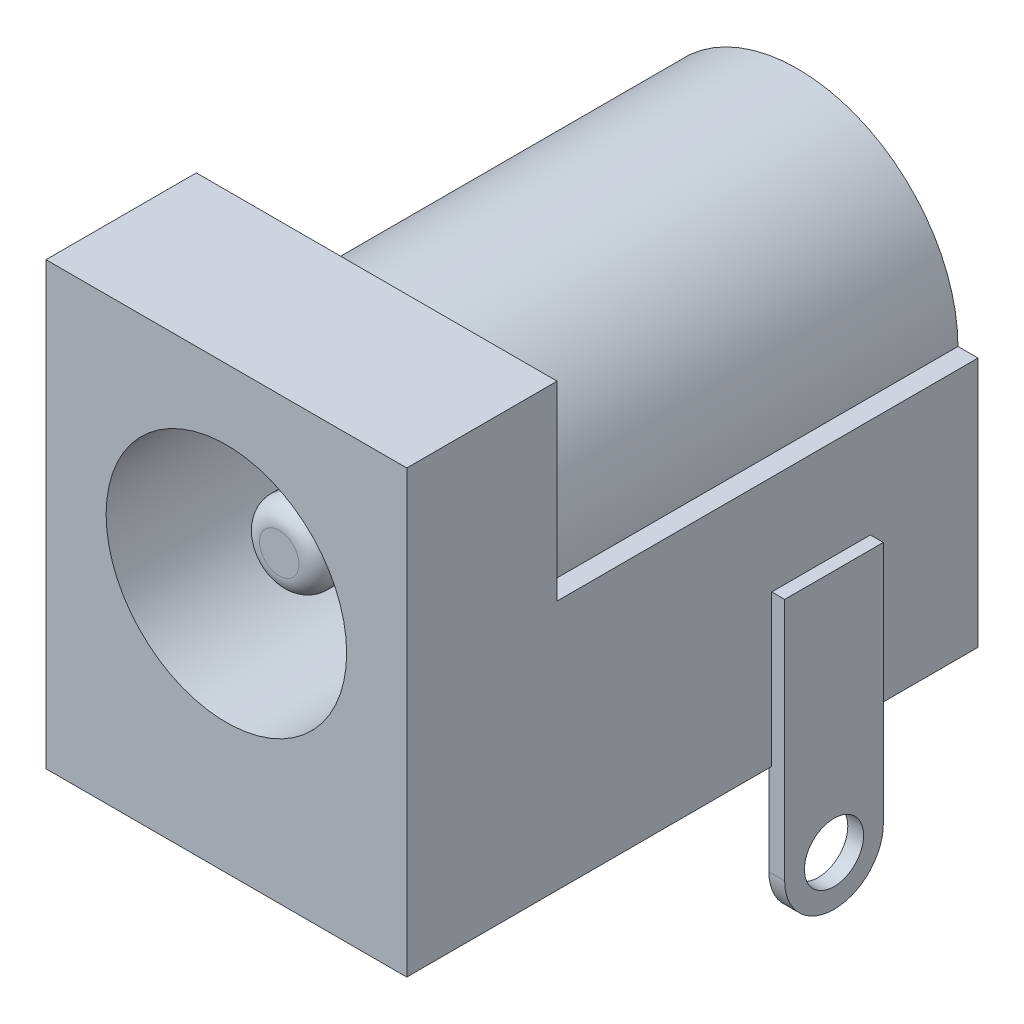
ISO-10303-21;
HEADER;
FILE_DESCRIPTION(('STEP AP214'),'2;1');
FILE_NAME('part.step','',(''),(''),'','','');
FILE_SCHEMA(('AUTOMOTIVE_DESIGN { 1 0 10303 214 1 1 1 1 }'));
ENDSEC;
DATA;
#1=APPLICATION_CONTEXT('core data for automotive mechanical design processes');
#2=APPLICATION_PROTOCOL_DEFINITION('international standard','automotive_design',2000,#1);
#3=PRODUCT_CONTEXT('',#1,'mechanical');
#4=PRODUCT('Part','Part','',(#3));
#5=PRODUCT_RELATED_PRODUCT_CATEGORY('part','',(#4));
#6=PRODUCT_DEFINITION_FORMATION('','',#4);
#7=PRODUCT_DEFINITION_CONTEXT('part definition',#1,'design');
#8=PRODUCT_DEFINITION('design','',#6,#7);
#9=PRODUCT_DEFINITION_SHAPE('','',#8);
#10=(LENGTH_UNIT() NAMED_UNIT(*) SI_UNIT(.MILLI.,.METRE.));
#11=(NAMED_UNIT(*) PLANE_ANGLE_UNIT() SI_UNIT($,.RADIAN.));
#12=(NAMED_UNIT(*) SI_UNIT($,.STERADIAN.) SOLID_ANGLE_UNIT());
#13=UNCERTAINTY_MEASURE_WITH_UNIT(LENGTH_MEASURE(1.E-05),#10,'distance_accuracy_value','');
#14=(GEOMETRIC_REPRESENTATION_CONTEXT(3) GLOBAL_UNCERTAINTY_ASSIGNED_CONTEXT((#13)) GLOBAL_UNIT_ASSIGNED_CONTEXT((#10,
#11,#12)) REPRESENTATION_CONTEXT('',''));
#15=CARTESIAN_POINT('',(0.,0.,0.));
#16=DIRECTION('',(0.,0.,1.));
#17=DIRECTION('',(1.,0.,0.));
#18=AXIS2_PLACEMENT_3D('',#15,#16,#17);
#19=CARTESIAN_POINT('',(-4.572,0.,-3.81));
#20=DIRECTION('',(0.,-1.,0.));
#21=DIRECTION('',(1.,0.,0.));
#22=AXIS2_PLACEMENT_3D('',#19,#20,#21);
#23=PLANE('',#22);
#24=DIRECTION('',(-1.,0.,0.));
#25=VECTOR('',#24,1.);
#26=CARTESIAN_POINT('',(-1.1,0.,-7.65));
#27=LINE('',#26,#25);
#28=CARTESIAN_POINT('',(1.1,0.,-7.65));
#29=VERTEX_POINT('',#28);
#30=CARTESIAN_POINT('',(-1.1,0.,-7.65));
#31=VERTEX_POINT('',#30);
#32=EDGE_CURVE('E56',#29,#31,#27,.T.);
#33=ORIENTED_EDGE('',*,*,#32,.T.);
#34=DIRECTION('',(0.,0.,-1.));
#35=VECTOR('',#34,1.);
#36=CARTESIAN_POINT('',(-1.1,0.,-7.35));
#37=LINE('',#36,#35);
#38=CARTESIAN_POINT('',(-1.1,0.,-7.35));
#39=VERTEX_POINT('',#38);
#40=EDGE_CURVE('E256',#39,#31,#37,.T.);
#41=ORIENTED_EDGE('',*,*,#40,.F.);
#42=DIRECTION('',(-1.,0.,0.));
#43=VECTOR('',#42,1.);
#44=CARTESIAN_POINT('',(-1.1,0.,-7.35));
#45=LINE('',#44,#43);
#46=CARTESIAN_POINT('',(1.1,0.,-7.35));
#47=VERTEX_POINT('',#46);
#48=EDGE_CURVE('E238',#47,#39,#45,.T.);
#49=ORIENTED_EDGE('',*,*,#48,.F.);
#50=DIRECTION('',(0.,0.,-1.));
#51=VECTOR('',#50,1.);
#52=CARTESIAN_POINT('',(1.1,0.,-7.35));
#53=LINE('',#52,#51);
#54=EDGE_CURVE('E247',#47,#29,#53,.T.);
#55=ORIENTED_EDGE('',*,*,#54,.T.);
#56=EDGE_LOOP('',(#33,#41,#49,#55));
#57=FACE_BOUND('',#56,.T.);
#58=DIRECTION('',(0.,0.,-1.));
#59=VECTOR('',#58,1.);
#60=CARTESIAN_POINT('',(4.5,0.,-3.81));
#61=LINE('',#60,#59);
#62=CARTESIAN_POINT('',(4.5,0.,-9.2499999999999));
#63=VERTEX_POINT('',#62);
#64=CARTESIAN_POINT('',(4.5,0.,-11.7499999999999));
#65=VERTEX_POINT('',#64);
#66=EDGE_CURVE('E349',#63,#65,#61,.T.);
#67=ORIENTED_EDGE('',*,*,#66,.F.);
#68=DIRECTION('',(1.,0.,0.));
#69=VECTOR('',#68,1.);
#70=CARTESIAN_POINT('',(-4.572,0.,-9.2499999999999));
#71=LINE('',#70,#69);
#72=CARTESIAN_POINT('',(4.572,0.,-9.2499999999999));
#73=VERTEX_POINT('',#72);
#74=EDGE_CURVE('E41',#63,#73,#71,.T.);
#75=ORIENTED_EDGE('',*,*,#74,.T.);
#76=DIRECTION('',(0.,0.,1.));
#77=VECTOR('',#76,1.);
#78=CARTESIAN_POINT('',(4.572,-1.52655665885959E-13,-3.8099999999999));
#79=LINE('',#78,#77);
#80=CARTESIAN_POINT('',(4.572,-1.04083408558608E-13,1.04083408558608E-13));
#81=VERTEX_POINT('',#80);
#82=EDGE_CURVE('E356',#73,#81,#79,.T.);
#83=ORIENTED_EDGE('',*,*,#82,.T.);
#84=DIRECTION('',(1.,0.,0.));
#85=VECTOR('',#84,1.);
#86=CARTESIAN_POINT('',(-4.572,0.,0.));
#87=LINE('',#86,#85);
#88=CARTESIAN_POINT('',(-4.572,0.,0.));
#89=VERTEX_POINT('',#88);
#90=EDGE_CURVE('E393',#89,#81,#87,.T.);
#91=ORIENTED_EDGE('',*,*,#90,.F.);
#92=DIRECTION('',(0.,0.,1.));
#93=VECTOR('',#92,1.);
#94=CARTESIAN_POINT('',(-4.572,0.,-3.81));
#95=LINE('',#94,#93);
#96=CARTESIAN_POINT('',(-4.57200000000008,0.,-14.478));
#97=VERTEX_POINT('',#96);
#98=EDGE_CURVE('E366',#97,#89,#95,.T.);
#99=ORIENTED_EDGE('',*,*,#98,.F.);
#100=DIRECTION('',(-1.,0.,0.));
#101=VECTOR('',#100,1.);
#102=CARTESIAN_POINT('',(-4.57200000000008,0.,-14.478));
#103=LINE('',#102,#101);
#104=CARTESIAN_POINT('',(4.57199999999992,-1.52655665885959E-13,-14.4779999999999));
#105=VERTEX_POINT('',#104);
#106=EDGE_CURVE('E769',#105,#97,#103,.T.);
#107=ORIENTED_EDGE('',*,*,#106,.F.);
#108=CARTESIAN_POINT('',(4.572,0.,-11.7499999999999));
#109=VERTEX_POINT('',#108);
#110=EDGE_CURVE('E365',#105,#109,#79,.T.);
#111=ORIENTED_EDGE('',*,*,#110,.T.);
#112=DIRECTION('',(-1.,0.,0.));
#113=VECTOR('',#112,1.);
#114=CARTESIAN_POINT('',(-4.572,0.,-11.7499999999999));
#115=LINE('',#114,#113);
#116=EDGE_CURVE('E346',#109,#65,#115,.T.);
#117=ORIENTED_EDGE('',*,*,#116,.T.);
#118=EDGE_LOOP('',(#67,#75,#83,#91,#99,#107,#111,#117));
#119=FACE_BOUND('',#118,.T.);
#120=DIRECTION('',(-1.,0.,0.));
#121=VECTOR('',#120,1.);
#122=CARTESIAN_POINT('',(1.425,-1.52655665885959E-13,-13.9));
#123=LINE('',#122,#121);
#124=CARTESIAN_POINT('',(1.425,0.,-13.9));
#125=VERTEX_POINT('',#124);
#126=CARTESIAN_POINT('',(-1.425,-1.53004678696798E-13,-13.9));
#127=VERTEX_POINT('',#126);
#128=EDGE_CURVE('E48',#125,#127,#123,.T.);
#129=ORIENTED_EDGE('',*,*,#128,.T.);
#130=DIRECTION('',(0.,0.,-1.));
#131=VECTOR('',#130,1.);
#132=CARTESIAN_POINT('',(-1.425,-1.53004678696798E-13,-13.5));
#133=LINE('',#132,#131);
#134=CARTESIAN_POINT('',(-1.425,-1.53004678696798E-13,-13.5));
#135=VERTEX_POINT('',#134);
#136=EDGE_CURVE('E192',#135,#127,#133,.T.);
#137=ORIENTED_EDGE('',*,*,#136,.F.);
#138=DIRECTION('',(-1.,0.,0.));
#139=VECTOR('',#138,1.);
#140=CARTESIAN_POINT('',(1.425,-1.52655665885959E-13,-13.5));
#141=LINE('',#140,#139);
#142=CARTESIAN_POINT('',(1.425,-1.52655665885959E-13,-13.5));
#143=VERTEX_POINT('',#142);
#144=EDGE_CURVE('E214',#143,#135,#141,.T.);
#145=ORIENTED_EDGE('',*,*,#144,.F.);
#146=DIRECTION('',(0.,0.,-1.));
#147=VECTOR('',#146,1.);
#148=CARTESIAN_POINT('',(1.425,-1.52655665885959E-13,-13.5));
#149=LINE('',#148,#147);
#150=EDGE_CURVE('E203',#143,#125,#149,.T.);
#151=ORIENTED_EDGE('',*,*,#150,.T.);
#152=EDGE_LOOP('',(#129,#137,#145,#151));
#153=FACE_BOUND('',#152,.T.);
#154=ADVANCED_FACE('F33',(#57,#119,#153),#23,.T.);
#155=CARTESIAN_POINT('',(4.572,-1.52655665885959E-13,-3.8099999999999));
#156=DIRECTION('',(1.,0.,0.));
#157=DIRECTION('',(0.,0.,-1.));
#158=AXIS2_PLACEMENT_3D('',#155,#156,#157);
#159=PLANE('',#158);
#160=ORIENTED_EDGE('',*,*,#82,.F.);
#161=DIRECTION('',(0.,1.,0.));
#162=VECTOR('',#161,1.);
#163=CARTESIAN_POINT('',(4.57200000000002,-1.51128660107753E-13,-9.2499999999999));
#164=LINE('',#163,#162);
#165=CARTESIAN_POINT('',(4.57200000000002,3.8299999999999,-9.2499999999999));
#166=VERTEX_POINT('',#165);
#167=EDGE_CURVE('E295',#73,#166,#164,.T.);
#168=ORIENTED_EDGE('',*,*,#167,.T.);
#169=DIRECTION('',(0.,0.,-1.));
#170=VECTOR('',#169,1.);
#171=CARTESIAN_POINT('',(4.572,3.8299999999999,-3.8099999999999));
#172=LINE('',#171,#170);
#173=CARTESIAN_POINT('',(4.57200000000003,3.8299999999999,-11.7499999999999));
#174=VERTEX_POINT('',#173);
#175=EDGE_CURVE('E12',#166,#174,#172,.T.);
#176=ORIENTED_EDGE('',*,*,#175,.T.);
#177=DIRECTION('',(0.,-1.,0.));
#178=VECTOR('',#177,1.);
#179=CARTESIAN_POINT('',(4.57200000000003,-1.52655665885959E-13,-11.7499999999999));
#180=LINE('',#179,#178);
#181=EDGE_CURVE('E292',#174,#109,#180,.T.);
#182=ORIENTED_EDGE('',*,*,#181,.T.);
#183=ORIENTED_EDGE('',*,*,#110,.F.);
#184=DIRECTION('',(0.,-1.,0.));
#185=VECTOR('',#184,1.);
#186=CARTESIAN_POINT('',(4.57199999999992,-1.52655665885959E-13,-14.4779999999999));
#187=LINE('',#186,#185);
#188=CARTESIAN_POINT('',(4.572,6.34999999999983,-14.478));
#189=VERTEX_POINT('',#188);
#190=EDGE_CURVE('E766',#189,#105,#187,.T.);
#191=ORIENTED_EDGE('',*,*,#190,.F.);
#192=DIRECTION('',(0.,0.,1.));
#193=VECTOR('',#192,1.);
#194=CARTESIAN_POINT('',(4.572,6.34999999999983,-14.478));
#195=LINE('',#194,#193);
#196=CARTESIAN_POINT('',(4.57200000000001,6.34999999999983,-3.81));
#197=VERTEX_POINT('',#196);
#198=EDGE_CURVE('E323',#189,#197,#195,.T.);
#199=ORIENTED_EDGE('',*,*,#198,.T.);
#200=DIRECTION('',(0.,1.,0.));
#201=VECTOR('',#200,1.);
#202=CARTESIAN_POINT('',(4.572,-1.52655665885959E-13,-3.8099999999999));
#203=LINE('',#202,#201);
#204=CARTESIAN_POINT('',(4.572,11.1759999999998,-3.81));
#205=VERTEX_POINT('',#204);
#206=EDGE_CURVE('E320',#197,#205,#203,.T.);
#207=ORIENTED_EDGE('',*,*,#206,.T.);
#208=DIRECTION('',(0.,0.,1.));
#209=VECTOR('',#208,1.);
#210=CARTESIAN_POINT('',(4.572,11.1759999999998,-3.81));
#211=LINE('',#210,#209);
#212=CARTESIAN_POINT('',(4.572,11.1759999999999,0.));
#213=VERTEX_POINT('',#212);
#214=EDGE_CURVE('E369',#205,#213,#211,.T.);
#215=ORIENTED_EDGE('',*,*,#214,.T.);
#216=DIRECTION('',(0.,1.,0.));
#217=VECTOR('',#216,1.);
#218=CARTESIAN_POINT('',(4.572,-1.04083408558608E-13,1.04083408558608E-13));
#219=LINE('',#218,#217);
#220=EDGE_CURVE('E363',#81,#213,#219,.T.);
#221=ORIENTED_EDGE('',*,*,#220,.F.);
#222=EDGE_LOOP('',(#160,#168,#176,#182,#183,#191,#199,#207,#215,#221));
#223=FACE_BOUND('',#222,.T.);
#224=ADVANCED_FACE('F361',(#223),#159,.T.);
#225=CARTESIAN_POINT('',(0.,6.3499999999999,-9.1440000000001));
#226=DIRECTION('',(0.,0.,1.));
#227=DIRECTION('',(1.,0.,0.));
#228=AXIS2_PLACEMENT_3D('',#225,#226,#227);
#229=PLANE('',#228);
#230=CARTESIAN_POINT('',(0.,6.3499999999999,-9.1440000000001));
#231=DIRECTION('',(0.,0.,1.));
#232=DIRECTION('',(1.,0.,0.));
#233=AXIS2_PLACEMENT_3D('',#230,#231,#232);
#234=CIRCLE('',#233,3.048);
#235=CARTESIAN_POINT('',(3.048,6.3499999999999,-9.14400000000009));
#236=VERTEX_POINT('',#235);
#237=EDGE_CURVE('E304',#236,#236,#234,.T.);
#238=ORIENTED_EDGE('',*,*,#237,.T.);
#239=EDGE_LOOP('',(#238));
#240=FACE_BOUND('',#239,.T.);
#241=CARTESIAN_POINT('',(0.,6.3499999999999,-9.14400000000011));
#242=DIRECTION('',(0.,0.,1.));
#243=DIRECTION('',(1.,0.,0.));
#244=AXIS2_PLACEMENT_3D('',#241,#242,#243);
#245=CIRCLE('',#244,1.);
#246=CARTESIAN_POINT('',(-1.,6.3499999999999,-9.14400000000011));
#247=VERTEX_POINT('',#246);
#248=EDGE_CURVE('E298',#247,#247,#245,.T.);
#249=ORIENTED_EDGE('',*,*,#248,.F.);
#250=EDGE_LOOP('',(#249));
#251=FACE_BOUND('',#250,.T.);
#252=ADVANCED_FACE('F404',(#240,#251),#229,.T.);
#253=CARTESIAN_POINT('',(-4.572,0.,-3.81));
#254=DIRECTION('',(-1.,0.,0.));
#255=DIRECTION('',(0.,-1.,0.));
#256=AXIS2_PLACEMENT_3D('',#253,#254,#255);
#257=PLANE('',#256);
#258=DIRECTION('',(0.,-1.,0.));
#259=VECTOR('',#258,1.);
#260=CARTESIAN_POINT('',(-4.572,0.,0.));
#261=LINE('',#260,#259);
#262=CARTESIAN_POINT('',(-4.572,11.176,-1.04083408558608E-13));
#263=VERTEX_POINT('',#262);
#264=EDGE_CURVE('E778',#263,#89,#261,.T.);
#265=ORIENTED_EDGE('',*,*,#264,.F.);
#266=DIRECTION('',(0.,0.,1.));
#267=VECTOR('',#266,1.);
#268=CARTESIAN_POINT('',(-4.57200000000001,11.176,-3.8100000000001));
#269=LINE('',#268,#267);
#270=CARTESIAN_POINT('',(-4.57200000000001,11.176,-3.8100000000001));
#271=VERTEX_POINT('',#270);
#272=EDGE_CURVE('E343',#271,#263,#269,.T.);
#273=ORIENTED_EDGE('',*,*,#272,.F.);
#274=DIRECTION('',(0.,-1.,0.));
#275=VECTOR('',#274,1.);
#276=CARTESIAN_POINT('',(-4.572,0.,-3.81));
#277=LINE('',#276,#275);
#278=CARTESIAN_POINT('',(-4.572,6.34999999999998,-3.8100000000001));
#279=VERTEX_POINT('',#278);
#280=EDGE_CURVE('E374',#271,#279,#277,.T.);
#281=ORIENTED_EDGE('',*,*,#280,.T.);
#282=DIRECTION('',(0.,0.,1.));
#283=VECTOR('',#282,1.);
#284=CARTESIAN_POINT('',(-4.57200000000002,6.34999999999997,-14.4780000000001));
#285=LINE('',#284,#283);
#286=CARTESIAN_POINT('',(-4.57200000000002,6.34999999999997,-14.4780000000001));
#287=VERTEX_POINT('',#286);
#288=EDGE_CURVE('E327',#287,#279,#285,.T.);
#289=ORIENTED_EDGE('',*,*,#288,.F.);
#290=DIRECTION('',(0.,1.,0.));
#291=VECTOR('',#290,1.);
#292=CARTESIAN_POINT('',(-4.57200000000002,6.34999999999997,-14.4780000000001));
#293=LINE('',#292,#291);
#294=EDGE_CURVE('E762',#97,#287,#293,.T.);
#295=ORIENTED_EDGE('',*,*,#294,.F.);
#296=ORIENTED_EDGE('',*,*,#98,.T.);
#297=EDGE_LOOP('',(#265,#273,#281,#289,#295,#296));
#298=FACE_BOUND('',#297,.T.);
#299=ADVANCED_FACE('F35',(#298),#257,.T.);
#300=CARTESIAN_POINT('',(-4.57200000000001,11.176,-3.8100000000001));
#301=DIRECTION('',(0.,1.,0.));
#302=DIRECTION('',(-1.,0.,0.));
#303=AXIS2_PLACEMENT_3D('',#300,#301,#302);
#304=PLANE('',#303);
#305=DIRECTION('',(-1.,0.,0.));
#306=VECTOR('',#305,1.);
#307=CARTESIAN_POINT('',(-4.572,11.176,-1.04083408558608E-13));
#308=LINE('',#307,#306);
#309=EDGE_CURVE('E377',#213,#263,#308,.T.);
#310=ORIENTED_EDGE('',*,*,#309,.F.);
#311=ORIENTED_EDGE('',*,*,#214,.F.);
#312=DIRECTION('',(-1.,0.,0.));
#313=VECTOR('',#312,1.);
#314=CARTESIAN_POINT('',(-4.57200000000001,11.176,-3.8100000000001));
#315=LINE('',#314,#313);
#316=EDGE_CURVE('E370',#205,#271,#315,.T.);
#317=ORIENTED_EDGE('',*,*,#316,.T.);
#318=ORIENTED_EDGE('',*,*,#272,.T.);
#319=EDGE_LOOP('',(#310,#311,#317,#318));
#320=FACE_BOUND('',#319,.T.);
#321=ADVANCED_FACE('F394',(#320),#304,.T.);
#322=CARTESIAN_POINT('',(-4.57200000000001,11.176,-3.8100000000001));
#323=DIRECTION('',(0.,0.,-1.));
#324=DIRECTION('',(-1.,0.,0.));
#325=AXIS2_PLACEMENT_3D('',#322,#323,#324);
#326=PLANE('',#325);
#327=DIRECTION('',(1.,0.,0.));
#328=VECTOR('',#327,1.);
#329=CARTESIAN_POINT('',(-4.064,6.34999999999999,-3.8100000000001));
#330=LINE('',#329,#328);
#331=CARTESIAN_POINT('',(-4.064,6.34999999999999,-3.8100000000001));
#332=VERTEX_POINT('',#331);
#333=EDGE_CURVE('E319',#279,#332,#330,.T.);
#334=ORIENTED_EDGE('',*,*,#333,.F.);
#335=ORIENTED_EDGE('',*,*,#280,.F.);
#336=ORIENTED_EDGE('',*,*,#316,.F.);
#337=ORIENTED_EDGE('',*,*,#206,.F.);
#338=DIRECTION('',(1.,0.,0.));
#339=VECTOR('',#338,1.);
#340=CARTESIAN_POINT('',(4.06399999999999,6.3499999999999,-3.8100000000001));
#341=LINE('',#340,#339);
#342=CARTESIAN_POINT('',(4.06399999999999,6.3499999999999,-3.8100000000001));
#343=VERTEX_POINT('',#342);
#344=EDGE_CURVE('E310',#343,#197,#341,.T.);
#345=ORIENTED_EDGE('',*,*,#344,.F.);
#346=CARTESIAN_POINT('',(0.,6.3499999999999,-3.8100000000001));
#347=DIRECTION('',(0.,0.,-1.));
#348=DIRECTION('',(1.,0.,0.));
#349=AXIS2_PLACEMENT_3D('',#346,#347,#348);
#350=CIRCLE('',#349,4.064);
#351=EDGE_CURVE('E307',#332,#343,#350,.T.);
#352=ORIENTED_EDGE('',*,*,#351,.F.);
#353=EDGE_LOOP('',(#334,#335,#336,#337,#345,#352));
#354=FACE_BOUND('',#353,.T.);
#355=ADVANCED_FACE('F396',(#354),#326,.T.);
#356=CARTESIAN_POINT('',(-4.572,11.176,-1.04083408558608E-13));
#357=DIRECTION('',(0.,0.,-1.));
#358=DIRECTION('',(-1.,0.,0.));
#359=AXIS2_PLACEMENT_3D('',#356,#357,#358);
#360=PLANE('',#359);
#361=CARTESIAN_POINT('',(0.,6.3499999999999,-1.04083408558608E-13));
#362=DIRECTION('',(0.,0.,1.));
#363=DIRECTION('',(1.,0.,0.));
#364=AXIS2_PLACEMENT_3D('',#361,#362,#363);
#365=CIRCLE('',#364,3.048);
#366=CARTESIAN_POINT('',(3.048,6.3499999999999,0.));
#367=VERTEX_POINT('',#366);
#368=EDGE_CURVE('E301',#367,#367,#365,.T.);
#369=ORIENTED_EDGE('',*,*,#368,.F.);
#370=EDGE_LOOP('',(#369));
#371=FACE_BOUND('',#370,.T.);
#372=ORIENTED_EDGE('',*,*,#264,.T.);
#373=ORIENTED_EDGE('',*,*,#90,.T.);
#374=ORIENTED_EDGE('',*,*,#220,.T.);
#375=ORIENTED_EDGE('',*,*,#309,.T.);
#376=EDGE_LOOP('',(#372,#373,#374,#375));
#377=FACE_BOUND('',#376,.T.);
#378=ADVANCED_FACE('F392',(#371,#377),#360,.F.);
#379=CARTESIAN_POINT('',(0.,6.3499999999999,-14.4780000000001));
#380=DIRECTION('',(0.,0.,1.));
#381=DIRECTION('',(1.,0.,0.));
#382=AXIS2_PLACEMENT_3D('',#379,#380,#381);
#383=CYLINDRICAL_SURFACE('',#382,4.064);
#384=ORIENTED_EDGE('',*,*,#351,.T.);
#385=DIRECTION('',(0.,0.,1.));
#386=VECTOR('',#385,1.);
#387=CARTESIAN_POINT('',(4.06399999999999,6.34999999999984,-14.4780000000001));
#388=LINE('',#387,#386);
#389=CARTESIAN_POINT('',(4.06399999999999,6.34999999999984,-14.4780000000001));
#390=VERTEX_POINT('',#389);
#391=EDGE_CURVE('E326',#390,#343,#388,.T.);
#392=ORIENTED_EDGE('',*,*,#391,.F.);
#393=CARTESIAN_POINT('',(0.,6.3499999999999,-14.4780000000001));
#394=DIRECTION('',(0.,0.,-1.));
#395=DIRECTION('',(1.,0.,0.));
#396=AXIS2_PLACEMENT_3D('',#393,#394,#395);
#397=CIRCLE('',#396,4.064);
#398=CARTESIAN_POINT('',(-4.06400000000001,6.34999999999999,-14.4780000000001));
#399=VERTEX_POINT('',#398);
#400=EDGE_CURVE('E313',#399,#390,#397,.T.);
#401=ORIENTED_EDGE('',*,*,#400,.F.);
#402=DIRECTION('',(0.,0.,1.));
#403=VECTOR('',#402,1.);
#404=CARTESIAN_POINT('',(-4.06400000000001,6.34999999999999,-14.4780000000001));
#405=LINE('',#404,#403);
#406=EDGE_CURVE('E336',#399,#332,#405,.T.);
#407=ORIENTED_EDGE('',*,*,#406,.T.);
#408=EDGE_LOOP('',(#384,#392,#401,#407));
#409=FACE_BOUND('',#408,.T.);
#410=ADVANCED_FACE('F510',(#409),#383,.T.);
#411=CARTESIAN_POINT('',(4.06399999999999,6.34999999999984,-14.4780000000001));
#412=DIRECTION('',(0.,-1.,0.));
#413=DIRECTION('',(1.,0.,0.));
#414=AXIS2_PLACEMENT_3D('',#411,#412,#413);
#415=PLANE('',#414);
#416=ORIENTED_EDGE('',*,*,#344,.T.);
#417=ORIENTED_EDGE('',*,*,#198,.F.);
#418=DIRECTION('',(1.,0.,0.));
#419=VECTOR('',#418,1.);
#420=CARTESIAN_POINT('',(4.06399999999999,6.34999999999984,-14.4780000000001));
#421=LINE('',#420,#419);
#422=EDGE_CURVE('E770',#390,#189,#421,.T.);
#423=ORIENTED_EDGE('',*,*,#422,.F.);
#424=ORIENTED_EDGE('',*,*,#391,.T.);
#425=EDGE_LOOP('',(#416,#417,#423,#424));
#426=FACE_BOUND('',#425,.T.);
#427=ADVANCED_FACE('F506',(#426),#415,.F.);
#428=CARTESIAN_POINT('',(-4.06400000000001,6.34999999999999,-14.4780000000001));
#429=DIRECTION('',(0.,-1.,0.));
#430=DIRECTION('',(1.,0.,0.));
#431=AXIS2_PLACEMENT_3D('',#428,#429,#430);
#432=PLANE('',#431);
#433=ORIENTED_EDGE('',*,*,#333,.T.);
#434=ORIENTED_EDGE('',*,*,#406,.F.);
#435=DIRECTION('',(1.,0.,0.));
#436=VECTOR('',#435,1.);
#437=CARTESIAN_POINT('',(-4.06400000000001,6.34999999999999,-14.4780000000001));
#438=LINE('',#437,#436);
#439=EDGE_CURVE('E760',#287,#399,#438,.T.);
#440=ORIENTED_EDGE('',*,*,#439,.F.);
#441=ORIENTED_EDGE('',*,*,#288,.T.);
#442=EDGE_LOOP('',(#433,#434,#440,#441));
#443=FACE_BOUND('',#442,.T.);
#444=ADVANCED_FACE('F502',(#443),#432,.F.);
#445=CARTESIAN_POINT('',(0.,6.3499999999999,-14.4780000000001));
#446=DIRECTION('',(0.,0.,1.));
#447=DIRECTION('',(1.,0.,0.));
#448=AXIS2_PLACEMENT_3D('',#445,#446,#447);
#449=PLANE('',#448);
#450=ORIENTED_EDGE('',*,*,#400,.T.);
#451=ORIENTED_EDGE('',*,*,#422,.T.);
#452=ORIENTED_EDGE('',*,*,#190,.T.);
#453=ORIENTED_EDGE('',*,*,#106,.T.);
#454=ORIENTED_EDGE('',*,*,#294,.T.);
#455=ORIENTED_EDGE('',*,*,#439,.T.);
#456=EDGE_LOOP('',(#450,#451,#452,#453,#454,#455));
#457=FACE_BOUND('',#456,.T.);
#458=ADVANCED_FACE('F498',(#457),#449,.F.);
#459=CARTESIAN_POINT('',(0.,6.3499999999999,-9.1440000000001));
#460=DIRECTION('',(0.,0.,1.));
#461=DIRECTION('',(1.,0.,0.));
#462=AXIS2_PLACEMENT_3D('',#459,#460,#461);
#463=CYLINDRICAL_SURFACE('',#462,3.048);
#464=ORIENTED_EDGE('',*,*,#237,.F.);
#465=EDGE_LOOP('',(#464));
#466=FACE_BOUND('',#465,.T.);
#467=ORIENTED_EDGE('',*,*,#368,.T.);
#468=EDGE_LOOP('',(#467));
#469=FACE_BOUND('',#468,.T.);
#470=ADVANCED_FACE('F491',(#466,#469),#463,.F.);
#471=CARTESIAN_POINT('',(0.,6.3499999999999,2.82842712474607));
#472=DIRECTION('',(0.,0.,-1.));
#473=DIRECTION('',(-1.,0.,0.));
#474=AXIS2_PLACEMENT_3D('',#471,#472,#473);
#475=CYLINDRICAL_SURFACE('',#474,1.);
#476=CARTESIAN_POINT('',(0.,6.3499999999999,-1.84000000000013));
#477=DIRECTION('',(0.,0.,-1.));
#478=DIRECTION('',(-1.,0.,0.));
#479=AXIS2_PLACEMENT_3D('',#476,#477,#478);
#480=CIRCLE('',#479,1.);
#481=CARTESIAN_POINT('',(-1.,6.3499999999999,-1.84000000000012));
#482=VERTEX_POINT('',#481);
#483=EDGE_CURVE('E339',#482,#482,#480,.T.);
#484=CARTESIAN_POINT('',(-1.,6.3499999999999,-1.84000000000012));
#485=CARTESIAN_POINT('',(-1.,6.3499999999999,-1.91608333333346));
#486=CARTESIAN_POINT('',(-1.,6.3499999999999,-1.99216666666679));
#487=CARTESIAN_POINT('',(-1.,6.3499999999999,-2.14433333333345));
#488=CARTESIAN_POINT('',(-1.,6.3499999999999,-2.22041666666679));
#489=CARTESIAN_POINT('',(-1.,6.3499999999999,-2.37258333333345));
#490=CARTESIAN_POINT('',(-1.,6.3499999999999,-2.44866666666679));
#491=CARTESIAN_POINT('',(-1.,6.3499999999999,-2.60083333333345));
#492=CARTESIAN_POINT('',(-1.,6.3499999999999,-2.67691666666679));
#493=CARTESIAN_POINT('',(-1.,6.3499999999999,-2.82908333333345));
#494=CARTESIAN_POINT('',(-1.,6.3499999999999,-2.90516666666679));
#495=CARTESIAN_POINT('',(-1.,6.3499999999999,-3.05733333333345));
#496=CARTESIAN_POINT('',(-1.,6.3499999999999,-3.13341666666679));
#497=CARTESIAN_POINT('',(-1.,6.3499999999999,-3.28558333333345));
#498=CARTESIAN_POINT('',(-1.,6.3499999999999,-3.36166666666679));
#499=CARTESIAN_POINT('',(-1.,6.3499999999999,-3.51383333333345));
#500=CARTESIAN_POINT('',(-1.,6.3499999999999,-3.58991666666679));
#501=CARTESIAN_POINT('',(-1.,6.3499999999999,-3.74208333333345));
#502=CARTESIAN_POINT('',(-1.,6.3499999999999,-3.81816666666679));
#503=CARTESIAN_POINT('',(-1.,6.3499999999999,-3.97033333333345));
#504=CARTESIAN_POINT('',(-1.,6.3499999999999,-4.04641666666678));
#505=CARTESIAN_POINT('',(-1.,6.3499999999999,-4.19858333333345));
#506=CARTESIAN_POINT('',(-1.,6.3499999999999,-4.27466666666678));
#507=CARTESIAN_POINT('',(-1.,6.3499999999999,-4.42683333333345));
#508=CARTESIAN_POINT('',(-1.,6.3499999999999,-4.50291666666678));
#509=CARTESIAN_POINT('',(-1.,6.3499999999999,-4.65508333333345));
#510=CARTESIAN_POINT('',(-1.,6.3499999999999,-4.73116666666678));
#511=CARTESIAN_POINT('',(-1.,6.3499999999999,-4.88333333333345));
#512=CARTESIAN_POINT('',(-1.,6.3499999999999,-4.95941666666678));
#513=CARTESIAN_POINT('',(-1.,6.3499999999999,-5.11158333333345));
#514=CARTESIAN_POINT('',(-1.,6.3499999999999,-5.18766666666678));
#515=CARTESIAN_POINT('',(-1.,6.3499999999999,-5.33983333333345));
#516=CARTESIAN_POINT('',(-1.,6.3499999999999,-5.41591666666678));
#517=CARTESIAN_POINT('',(-1.,6.3499999999999,-5.56808333333345));
#518=CARTESIAN_POINT('',(-1.,6.3499999999999,-5.64416666666678));
#519=CARTESIAN_POINT('',(-1.,6.3499999999999,-5.79633333333345));
#520=CARTESIAN_POINT('',(-1.,6.3499999999999,-5.87241666666678));
#521=CARTESIAN_POINT('',(-1.,6.3499999999999,-6.02458333333345));
#522=CARTESIAN_POINT('',(-1.,6.3499999999999,-6.10066666666678));
#523=CARTESIAN_POINT('',(-1.,6.3499999999999,-6.25283333333345));
#524=CARTESIAN_POINT('',(-1.,6.3499999999999,-6.32891666666678));
#525=CARTESIAN_POINT('',(-1.,6.3499999999999,-6.48108333333345));
#526=CARTESIAN_POINT('',(-1.,6.3499999999999,-6.55716666666678));
#527=CARTESIAN_POINT('',(-1.,6.3499999999999,-6.70933333333345));
#528=CARTESIAN_POINT('',(-1.,6.3499999999999,-6.78541666666678));
#529=CARTESIAN_POINT('',(-1.,6.3499999999999,-6.93758333333345));
#530=CARTESIAN_POINT('',(-1.,6.3499999999999,-7.01366666666678));
#531=CARTESIAN_POINT('',(-1.,6.3499999999999,-7.16583333333345));
#532=CARTESIAN_POINT('',(-1.,6.3499999999999,-7.24191666666678));
#533=CARTESIAN_POINT('',(-1.,6.3499999999999,-7.39408333333344));
#534=CARTESIAN_POINT('',(-1.,6.3499999999999,-7.47016666666678));
#535=CARTESIAN_POINT('',(-1.,6.3499999999999,-7.62233333333344));
#536=CARTESIAN_POINT('',(-1.,6.3499999999999,-7.69841666666678));
#537=CARTESIAN_POINT('',(-1.,6.3499999999999,-7.85058333333344));
#538=CARTESIAN_POINT('',(-1.,6.3499999999999,-7.92666666666678));
#539=CARTESIAN_POINT('',(-1.,6.3499999999999,-8.07883333333344));
#540=CARTESIAN_POINT('',(-1.,6.3499999999999,-8.15491666666678));
#541=CARTESIAN_POINT('',(-1.,6.3499999999999,-8.30708333333344));
#542=CARTESIAN_POINT('',(-1.,6.3499999999999,-8.38316666666678));
#543=CARTESIAN_POINT('',(-1.,6.3499999999999,-8.53533333333344));
#544=CARTESIAN_POINT('',(-1.,6.3499999999999,-8.61141666666678));
#545=CARTESIAN_POINT('',(-1.,6.3499999999999,-8.76358333333344));
#546=CARTESIAN_POINT('',(-1.,6.3499999999999,-8.83966666666678));
#547=CARTESIAN_POINT('',(-1.,6.3499999999999,-8.99183333333344));
#548=CARTESIAN_POINT('',(-1.,6.3499999999999,-9.06791666666678));
#549=CARTESIAN_POINT('',(-1.,6.3499999999999,-9.14400000000011));
#550=B_SPLINE_CURVE_WITH_KNOTS('',3,(#484,#485,#486,#487,#488,#489,#490,#491,#492,#493,#494,
#495,#496,#497,#498,#499,#500,#501,#502,#503,#504,#505,#506,#507,#508,#509,#510,#511,#512,#513,
#514,#515,#516,#517,#518,#519,#520,#521,#522,#523,#524,#525,#526,#527,#528,#529,#530,#531,#532,
#533,#534,#535,#536,#537,#538,#539,#540,#541,#542,#543,#544,#545,#546,#547,#548,#549),
.UNSPECIFIED.,.F.,.F.,(4,2,2,2,2,2,2,2,2,2,2,2,2,2,2,2,2,2,2,2,2,2,2,2,2,2,2,2,2,2,2,2,4),(0.,
0.228249999999999,0.456499999999999,0.684749999999999,0.912999999999999,1.14125,1.3695,1.59775,
1.826,2.05425,2.2825,2.51075,2.73899999999999,2.96725,3.19549999999999,3.42374999999999,
3.65199999999999,3.88024999999999,4.10849999999999,4.33674999999999,4.56499999999999,
4.79324999999999,5.02149999999999,5.24974999999999,5.47799999999999,5.70624999999999,
5.93449999999999,6.16274999999999,6.39099999999999,6.61924999999999,6.84749999999999,
7.07574999999999,7.30399999999999),.UNSPECIFIED.);
#551=EDGE_CURVE('BSEAM487',#482,#247,#550,.T.);
#552=ORIENTED_EDGE('',*,*,#483,.T.);
#553=ORIENTED_EDGE('',*,*,#248,.T.);
#554=ORIENTED_EDGE('',*,*,#551,.T.);
#555=ORIENTED_EDGE('',*,*,#551,.F.);
#556=EDGE_LOOP('',(#552,#554,#553,#555));
#557=FACE_BOUND('',#556,.T.);
#558=ADVANCED_FACE('F487',(#557),#475,.T.);
#559=CARTESIAN_POINT('',(-4.57200000000001,11.176,-1.3400000000001));
#560=DIRECTION('',(0.,0.,-1.));
#561=DIRECTION('',(-1.,0.,0.));
#562=AXIS2_PLACEMENT_3D('',#559,#560,#561);
#563=PLANE('',#562);
#564=CARTESIAN_POINT('',(0.,6.3499999999999,-1.34000000000012));
#565=DIRECTION('',(0.,0.,-1.));
#566=DIRECTION('',(-1.,0.,0.));
#567=AXIS2_PLACEMENT_3D('',#564,#565,#566);
#568=CIRCLE('',#567,0.5);
#569=CARTESIAN_POINT('',(-0.500000000000002,6.3499999999999,-1.34000000000012));
#570=VERTEX_POINT('',#569);
#571=EDGE_CURVE('E342',#570,#570,#568,.F.);
#572=ORIENTED_EDGE('',*,*,#571,.T.);
#573=EDGE_LOOP('',(#572));
#574=FACE_BOUND('',#573,.T.);
#575=ADVANCED_FACE('F483',(#574),#563,.F.);
#576=CARTESIAN_POINT('',(0.,6.3499999999999,-1.84000000000012));
#577=DIRECTION('',(0.,0.,-1.));
#578=DIRECTION('',(-1.,0.,0.));
#579=AXIS2_PLACEMENT_3D('',#576,#577,#578);
#580=DEGENERATE_TOROIDAL_SURFACE('',#579,0.5,0.5,.T.);
#581=ORIENTED_EDGE('',*,*,#571,.F.);
#582=EDGE_LOOP('',(#581));
#583=FACE_BOUND('',#582,.T.);
#584=ORIENTED_EDGE('',*,*,#483,.F.);
#585=EDGE_LOOP('',(#584));
#586=FACE_BOUND('',#585,.T.);
#587=ADVANCED_FACE('F466',(#583,#586),#580,.T.);
#588=CARTESIAN_POINT('',(4.9,-2.35000000000015,-10.4999999999999));
#589=DIRECTION('',(-1.,0.,0.));
#590=DIRECTION('',(0.,0.,1.));
#591=AXIS2_PLACEMENT_3D('',#588,#589,#590);
#592=PLANE('',#591);
#593=DIRECTION('',(0.,0.,1.));
#594=VECTOR('',#593,1.);
#595=CARTESIAN_POINT('',(4.9,3.8299999999999,-9.2499999999999));
#596=LINE('',#595,#594);
#597=CARTESIAN_POINT('',(4.9,3.8299999999999,-11.7499999999999));
#598=VERTEX_POINT('',#597);
#599=CARTESIAN_POINT('',(4.9,3.8299999999999,-9.2499999999999));
#600=VERTEX_POINT('',#599);
#601=EDGE_CURVE('E271',#598,#600,#596,.T.);
#602=ORIENTED_EDGE('',*,*,#601,.T.);
#603=DIRECTION('',(0.,-1.,0.));
#604=VECTOR('',#603,1.);
#605=CARTESIAN_POINT('',(4.9,3.8299999999999,-9.2499999999999));
#606=LINE('',#605,#604);
#607=CARTESIAN_POINT('',(4.9,-2.35000000000015,-9.2499999999999));
#608=VERTEX_POINT('',#607);
#609=EDGE_CURVE('E274',#600,#608,#606,.T.);
#610=ORIENTED_EDGE('',*,*,#609,.T.);
#611=CARTESIAN_POINT('',(4.9,-2.35000000000015,-10.4999999999999));
#612=DIRECTION('',(1.,0.,0.));
#613=DIRECTION('',(0.,0.,1.));
#614=AXIS2_PLACEMENT_3D('',#611,#612,#613);
#615=CIRCLE('',#614,1.25);
#616=CARTESIAN_POINT('',(4.9,-2.35000000000015,-11.7499999999999));
#617=VERTEX_POINT('',#616);
#618=EDGE_CURVE('E276',#608,#617,#615,.T.);
#619=ORIENTED_EDGE('',*,*,#618,.T.);
#620=DIRECTION('',(0.,1.,0.));
#621=VECTOR('',#620,1.);
#622=CARTESIAN_POINT('',(4.9,3.8299999999999,-11.7499999999999));
#623=LINE('',#622,#621);
#624=EDGE_CURVE('E278',#617,#598,#623,.T.);
#625=ORIENTED_EDGE('',*,*,#624,.T.);
#626=EDGE_LOOP('',(#602,#610,#619,#625));
#627=FACE_BOUND('',#626,.T.);
#628=CARTESIAN_POINT('',(4.9,-2.35000000000015,-10.4999999999999));
#629=DIRECTION('',(1.,0.,0.));
#630=DIRECTION('',(0.,0.,-1.));
#631=AXIS2_PLACEMENT_3D('',#628,#629,#630);
#632=CIRCLE('',#631,0.75);
#633=CARTESIAN_POINT('',(4.9,-2.35000000000015,-11.2499999999999));
#634=VERTEX_POINT('',#633);
#635=EDGE_CURVE('E262',#634,#634,#632,.T.);
#636=ORIENTED_EDGE('',*,*,#635,.F.);
#637=EDGE_LOOP('',(#636));
#638=FACE_BOUND('',#637,.T.);
#639=ADVANCED_FACE('F462',(#627,#638),#592,.F.);
#640=CARTESIAN_POINT('',(4.5,-2.35000000000015,-10.4999999999999));
#641=DIRECTION('',(-1.,0.,0.));
#642=DIRECTION('',(0.,0.,1.));
#643=AXIS2_PLACEMENT_3D('',#640,#641,#642);
#644=PLANE('',#643);
#645=DIRECTION('',(0.,-1.,0.));
#646=VECTOR('',#645,1.);
#647=CARTESIAN_POINT('',(4.5,3.8299999999999,-9.2499999999999));
#648=LINE('',#647,#646);
#649=CARTESIAN_POINT('',(4.5,-2.35000000000015,-9.2499999999999));
#650=VERTEX_POINT('',#649);
#651=EDGE_CURVE('E265',#63,#650,#648,.T.);
#652=ORIENTED_EDGE('',*,*,#651,.F.);
#653=ORIENTED_EDGE('',*,*,#66,.T.);
#654=DIRECTION('',(0.,1.,0.));
#655=VECTOR('',#654,1.);
#656=CARTESIAN_POINT('',(4.5,3.8299999999999,-11.7499999999999));
#657=LINE('',#656,#655);
#658=CARTESIAN_POINT('',(4.5,-2.35000000000015,-11.7499999999999));
#659=VERTEX_POINT('',#658);
#660=EDGE_CURVE('E269',#659,#65,#657,.T.);
#661=ORIENTED_EDGE('',*,*,#660,.F.);
#662=CARTESIAN_POINT('',(4.5,-2.35000000000015,-10.4999999999999));
#663=DIRECTION('',(1.,0.,0.));
#664=DIRECTION('',(0.,0.,1.));
#665=AXIS2_PLACEMENT_3D('',#662,#663,#664);
#666=CIRCLE('',#665,1.25);
#667=EDGE_CURVE('E267',#650,#659,#666,.T.);
#668=ORIENTED_EDGE('',*,*,#667,.F.);
#669=EDGE_LOOP('',(#652,#653,#661,#668));
#670=FACE_BOUND('',#669,.T.);
#671=CARTESIAN_POINT('',(4.5,-2.35000000000015,-10.4999999999999));
#672=DIRECTION('',(1.,0.,0.));
#673=DIRECTION('',(0.,0.,-1.));
#674=AXIS2_PLACEMENT_3D('',#671,#672,#673);
#675=CIRCLE('',#674,0.75);
#676=CARTESIAN_POINT('',(4.5,-2.35000000000015,-11.2499999999999));
#677=VERTEX_POINT('',#676);
#678=EDGE_CURVE('E259',#677,#677,#675,.T.);
#679=ORIENTED_EDGE('',*,*,#678,.T.);
#680=EDGE_LOOP('',(#679));
#681=FACE_BOUND('',#680,.T.);
#682=ADVANCED_FACE('F458',(#670,#681),#644,.T.);
#683=CARTESIAN_POINT('',(4.9,3.8299999999999,-9.2499999999999));
#684=DIRECTION('',(0.,-1.,0.));
#685=DIRECTION('',(0.,0.,-1.));
#686=AXIS2_PLACEMENT_3D('',#683,#684,#685);
#687=PLANE('',#686);
#688=ORIENTED_EDGE('',*,*,#175,.F.);
#689=DIRECTION('',(-1.,0.,0.));
#690=VECTOR('',#689,1.);
#691=CARTESIAN_POINT('',(4.9,3.8299999999999,-9.2499999999999));
#692=LINE('',#691,#690);
#693=EDGE_CURVE('E289',#600,#166,#692,.T.);
#694=ORIENTED_EDGE('',*,*,#693,.F.);
#695=ORIENTED_EDGE('',*,*,#601,.F.);
#696=DIRECTION('',(-1.,0.,0.));
#697=VECTOR('',#696,1.);
#698=CARTESIAN_POINT('',(4.9,3.8299999999999,-11.7499999999999));
#699=LINE('',#698,#697);
#700=EDGE_CURVE('E280',#598,#174,#699,.T.);
#701=ORIENTED_EDGE('',*,*,#700,.T.);
#702=EDGE_LOOP('',(#688,#694,#695,#701));
#703=FACE_BOUND('',#702,.T.);
#704=ADVANCED_FACE('F461',(#703),#687,.F.);
#705=CARTESIAN_POINT('',(4.9,3.8299999999999,-9.2499999999999));
#706=DIRECTION('',(0.,0.,-1.));
#707=DIRECTION('',(0.,1.,0.));
#708=AXIS2_PLACEMENT_3D('',#705,#706,#707);
#709=PLANE('',#708);
#710=ORIENTED_EDGE('',*,*,#167,.F.);
#711=ORIENTED_EDGE('',*,*,#74,.F.);
#712=ORIENTED_EDGE('',*,*,#651,.T.);
#713=DIRECTION('',(-1.,0.,0.));
#714=VECTOR('',#713,1.);
#715=CARTESIAN_POINT('',(4.9,-2.35000000000015,-9.2499999999999));
#716=LINE('',#715,#714);
#717=EDGE_CURVE('E286',#608,#650,#716,.T.);
#718=ORIENTED_EDGE('',*,*,#717,.F.);
#719=ORIENTED_EDGE('',*,*,#609,.F.);
#720=ORIENTED_EDGE('',*,*,#693,.T.);
#721=EDGE_LOOP('',(#710,#711,#712,#718,#719,#720));
#722=FACE_BOUND('',#721,.T.);
#723=ADVANCED_FACE('F474',(#722),#709,.F.);
#724=CARTESIAN_POINT('',(4.9,-2.35000000000015,-10.4999999999999));
#725=DIRECTION('',(-1.,0.,0.));
#726=DIRECTION('',(0.,0.,1.));
#727=AXIS2_PLACEMENT_3D('',#724,#725,#726);
#728=CYLINDRICAL_SURFACE('',#727,1.25);
#729=ORIENTED_EDGE('',*,*,#667,.T.);
#730=DIRECTION('',(-1.,0.,0.));
#731=VECTOR('',#730,1.);
#732=CARTESIAN_POINT('',(4.9,-2.35000000000015,-11.7499999999999));
#733=LINE('',#732,#731);
#734=EDGE_CURVE('E283',#617,#659,#733,.T.);
#735=ORIENTED_EDGE('',*,*,#734,.F.);
#736=ORIENTED_EDGE('',*,*,#618,.F.);
#737=ORIENTED_EDGE('',*,*,#717,.T.);
#738=EDGE_LOOP('',(#729,#735,#736,#737));
#739=FACE_BOUND('',#738,.T.);
#740=ADVANCED_FACE('F470',(#739),#728,.T.);
#741=CARTESIAN_POINT('',(4.9,3.8299999999999,-11.7499999999999));
#742=DIRECTION('',(0.,0.,1.));
#743=DIRECTION('',(1.,0.,0.));
#744=AXIS2_PLACEMENT_3D('',#741,#742,#743);
#745=PLANE('',#744);
#746=ORIENTED_EDGE('',*,*,#181,.F.);
#747=ORIENTED_EDGE('',*,*,#700,.F.);
#748=ORIENTED_EDGE('',*,*,#624,.F.);
#749=ORIENTED_EDGE('',*,*,#734,.T.);
#750=ORIENTED_EDGE('',*,*,#660,.T.);
#751=ORIENTED_EDGE('',*,*,#116,.F.);
#752=EDGE_LOOP('',(#746,#747,#748,#749,#750,#751));
#753=FACE_BOUND('',#752,.T.);
#754=ADVANCED_FACE('F456',(#753),#745,.F.);
#755=CARTESIAN_POINT('',(4.9,-2.35000000000015,-10.4999999999999));
#756=DIRECTION('',(-1.,0.,0.));
#757=DIRECTION('',(0.,0.,1.));
#758=AXIS2_PLACEMENT_3D('',#755,#756,#757);
#759=CYLINDRICAL_SURFACE('',#758,0.75);
#760=ORIENTED_EDGE('',*,*,#635,.T.);
#761=EDGE_LOOP('',(#760));
#762=FACE_BOUND('',#761,.T.);
#763=ORIENTED_EDGE('',*,*,#678,.F.);
#764=EDGE_LOOP('',(#763));
#765=FACE_BOUND('',#764,.T.);
#766=ADVANCED_FACE('F432',(#762,#765),#759,.F.);
#767=CARTESIAN_POINT('',(0.,-2.5,-7.35));
#768=DIRECTION('',(0.,0.,1.));
#769=DIRECTION('',(1.,0.,0.));
#770=AXIS2_PLACEMENT_3D('',#767,#768,#769);
#771=PLANE('',#770);
#772=ORIENTED_EDGE('',*,*,#48,.T.);
#773=DIRECTION('',(0.,-1.,0.));
#774=VECTOR('',#773,1.);
#775=CARTESIAN_POINT('',(-1.1,0.,-7.35));
#776=LINE('',#775,#774);
#777=CARTESIAN_POINT('',(-1.1,-2.5,-7.35));
#778=VERTEX_POINT('',#777);
#779=EDGE_CURVE('E241',#39,#778,#776,.T.);
#780=ORIENTED_EDGE('',*,*,#779,.T.);
#781=CARTESIAN_POINT('',(0.,-2.5,-7.35));
#782=DIRECTION('',(0.,0.,1.));
#783=DIRECTION('',(1.,0.,0.));
#784=AXIS2_PLACEMENT_3D('',#781,#782,#783);
#785=CIRCLE('',#784,1.1);
#786=CARTESIAN_POINT('',(1.1,-2.5,-7.35));
#787=VERTEX_POINT('',#786);
#788=EDGE_CURVE('E243',#778,#787,#785,.T.);
#789=ORIENTED_EDGE('',*,*,#788,.T.);
#790=DIRECTION('',(0.,1.,0.));
#791=VECTOR('',#790,1.);
#792=CARTESIAN_POINT('',(1.1,0.,-7.35));
#793=LINE('',#792,#791);
#794=EDGE_CURVE('E245',#787,#47,#793,.T.);
#795=ORIENTED_EDGE('',*,*,#794,.T.);
#796=EDGE_LOOP('',(#772,#780,#789,#795));
#797=FACE_BOUND('',#796,.T.);
#798=CARTESIAN_POINT('',(0.,-2.5,-7.35));
#799=DIRECTION('',(0.,0.,1.));
#800=DIRECTION('',(1.,0.,0.));
#801=AXIS2_PLACEMENT_3D('',#798,#799,#800);
#802=CIRCLE('',#801,0.75);
#803=CARTESIAN_POINT('',(0.75,-2.5,-7.35));
#804=VERTEX_POINT('',#803);
#805=EDGE_CURVE('E228',#804,#804,#802,.T.);
#806=ORIENTED_EDGE('',*,*,#805,.F.);
#807=EDGE_LOOP('',(#806));
#808=FACE_BOUND('',#807,.T.);
#809=ADVANCED_FACE('F429',(#797,#808),#771,.T.);
#810=CARTESIAN_POINT('',(0.,-2.5,-7.65));
#811=DIRECTION('',(0.,0.,1.));
#812=DIRECTION('',(1.,0.,0.));
#813=AXIS2_PLACEMENT_3D('',#810,#811,#812);
#814=PLANE('',#813);
#815=ORIENTED_EDGE('',*,*,#32,.F.);
#816=DIRECTION('',(0.,1.,0.));
#817=VECTOR('',#816,1.);
#818=CARTESIAN_POINT('',(1.1,0.,-7.65));
#819=LINE('',#818,#817);
#820=CARTESIAN_POINT('',(1.1,-2.5,-7.65));
#821=VERTEX_POINT('',#820);
#822=EDGE_CURVE('E236',#821,#29,#819,.T.);
#823=ORIENTED_EDGE('',*,*,#822,.F.);
#824=CARTESIAN_POINT('',(0.,-2.5,-7.65));
#825=DIRECTION('',(0.,0.,1.));
#826=DIRECTION('',(1.,0.,0.));
#827=AXIS2_PLACEMENT_3D('',#824,#825,#826);
#828=CIRCLE('',#827,1.1);
#829=CARTESIAN_POINT('',(-1.1,-2.5,-7.65));
#830=VERTEX_POINT('',#829);
#831=EDGE_CURVE('E234',#830,#821,#828,.T.);
#832=ORIENTED_EDGE('',*,*,#831,.F.);
#833=DIRECTION('',(0.,-1.,0.));
#834=VECTOR('',#833,1.);
#835=CARTESIAN_POINT('',(-1.1,0.,-7.65));
#836=LINE('',#835,#834);
#837=EDGE_CURVE('E232',#31,#830,#836,.T.);
#838=ORIENTED_EDGE('',*,*,#837,.F.);
#839=EDGE_LOOP('',(#815,#823,#832,#838));
#840=FACE_BOUND('',#839,.T.);
#841=CARTESIAN_POINT('',(0.,-2.5,-7.65));
#842=DIRECTION('',(0.,0.,1.));
#843=DIRECTION('',(1.,0.,0.));
#844=AXIS2_PLACEMENT_3D('',#841,#842,#843);
#845=CIRCLE('',#844,0.75);
#846=CARTESIAN_POINT('',(0.75,-2.5,-7.65));
#847=VERTEX_POINT('',#846);
#848=EDGE_CURVE('E198',#847,#847,#845,.T.);
#849=ORIENTED_EDGE('',*,*,#848,.T.);
#850=EDGE_LOOP('',(#849));
#851=FACE_BOUND('',#850,.T.);
#852=ADVANCED_FACE('F420',(#840,#851),#814,.F.);
#853=CARTESIAN_POINT('',(-1.1,0.,-7.35));
#854=DIRECTION('',(1.,0.,0.));
#855=DIRECTION('',(0.,1.,0.));
#856=AXIS2_PLACEMENT_3D('',#853,#854,#855);
#857=PLANE('',#856);
#858=ORIENTED_EDGE('',*,*,#837,.T.);
#859=DIRECTION('',(0.,0.,-1.));
#860=VECTOR('',#859,1.);
#861=CARTESIAN_POINT('',(-1.1,-2.5,-7.35));
#862=LINE('',#861,#860);
#863=EDGE_CURVE('E253',#778,#830,#862,.T.);
#864=ORIENTED_EDGE('',*,*,#863,.F.);
#865=ORIENTED_EDGE('',*,*,#779,.F.);
#866=ORIENTED_EDGE('',*,*,#40,.T.);
#867=EDGE_LOOP('',(#858,#864,#865,#866));
#868=FACE_BOUND('',#867,.T.);
#869=ADVANCED_FACE('F427',(#868),#857,.F.);
#870=CARTESIAN_POINT('',(0.,-2.5,-7.35));
#871=DIRECTION('',(0.,0.,-1.));
#872=DIRECTION('',(-1.,0.,0.));
#873=AXIS2_PLACEMENT_3D('',#870,#871,#872);
#874=CYLINDRICAL_SURFACE('',#873,1.1);
#875=ORIENTED_EDGE('',*,*,#831,.T.);
#876=DIRECTION('',(0.,0.,-1.));
#877=VECTOR('',#876,1.);
#878=CARTESIAN_POINT('',(1.1,-2.5,-7.35));
#879=LINE('',#878,#877);
#880=EDGE_CURVE('E250',#787,#821,#879,.T.);
#881=ORIENTED_EDGE('',*,*,#880,.F.);
#882=ORIENTED_EDGE('',*,*,#788,.F.);
#883=ORIENTED_EDGE('',*,*,#863,.T.);
#884=EDGE_LOOP('',(#875,#881,#882,#883));
#885=FACE_BOUND('',#884,.T.);
#886=ADVANCED_FACE('F423',(#885),#874,.T.);
#887=CARTESIAN_POINT('',(1.1,0.,-7.35));
#888=DIRECTION('',(-1.,0.,0.));
#889=DIRECTION('',(0.,-1.,0.));
#890=AXIS2_PLACEMENT_3D('',#887,#888,#889);
#891=PLANE('',#890);
#892=ORIENTED_EDGE('',*,*,#822,.T.);
#893=ORIENTED_EDGE('',*,*,#54,.F.);
#894=ORIENTED_EDGE('',*,*,#794,.F.);
#895=ORIENTED_EDGE('',*,*,#880,.T.);
#896=EDGE_LOOP('',(#892,#893,#894,#895));
#897=FACE_BOUND('',#896,.T.);
#898=ADVANCED_FACE('F417',(#897),#891,.F.);
#899=CARTESIAN_POINT('',(0.,-2.5,-7.35));
#900=DIRECTION('',(0.,0.,-1.));
#901=DIRECTION('',(-1.,0.,0.));
#902=AXIS2_PLACEMENT_3D('',#899,#900,#901);
#903=CYLINDRICAL_SURFACE('',#902,0.75);
#904=ORIENTED_EDGE('',*,*,#805,.T.);
#905=EDGE_LOOP('',(#904));
#906=FACE_BOUND('',#905,.T.);
#907=ORIENTED_EDGE('',*,*,#848,.F.);
#908=EDGE_LOOP('',(#907));
#909=FACE_BOUND('',#908,.T.);
#910=ADVANCED_FACE('F436',(#906,#909),#903,.F.);
#911=CARTESIAN_POINT('',(0.,-2.17500000000015,-13.5));
#912=DIRECTION('',(0.,0.,-1.));
#913=DIRECTION('',(-1.,0.,0.));
#914=AXIS2_PLACEMENT_3D('',#911,#912,#913);
#915=PLANE('',#914);
#916=ORIENTED_EDGE('',*,*,#144,.T.);
#917=DIRECTION('',(0.,-1.,0.));
#918=VECTOR('',#917,1.);
#919=CARTESIAN_POINT('',(-1.425,-1.53004678696798E-13,-13.5));
#920=LINE('',#919,#918);
#921=CARTESIAN_POINT('',(-1.425,-2.17500000000015,-13.5));
#922=VERTEX_POINT('',#921);
#923=EDGE_CURVE('E194',#135,#922,#920,.T.);
#924=ORIENTED_EDGE('',*,*,#923,.T.);
#925=CARTESIAN_POINT('',(0.,-2.17500000000015,-13.5));
#926=DIRECTION('',(0.,0.,1.));
#927=DIRECTION('',(-1.,0.,0.));
#928=AXIS2_PLACEMENT_3D('',#925,#926,#927);
#929=CIRCLE('',#928,1.425);
#930=CARTESIAN_POINT('',(1.425,-2.17500000000015,-13.5));
#931=VERTEX_POINT('',#930);
#932=EDGE_CURVE('E217',#922,#931,#929,.T.);
#933=ORIENTED_EDGE('',*,*,#932,.T.);
#934=DIRECTION('',(0.,1.,0.));
#935=VECTOR('',#934,1.);
#936=CARTESIAN_POINT('',(1.425,-1.52655665885959E-13,-13.5));
#937=LINE('',#936,#935);
#938=EDGE_CURVE('E219',#931,#143,#937,.T.);
#939=ORIENTED_EDGE('',*,*,#938,.T.);
#940=EDGE_LOOP('',(#916,#924,#933,#939));
#941=FACE_BOUND('',#940,.T.);
#942=CARTESIAN_POINT('',(0.,-2.17500000000015,-13.5));
#943=DIRECTION('',(0.,0.,1.));
#944=DIRECTION('',(1.,0.,0.));
#945=AXIS2_PLACEMENT_3D('',#942,#943,#944);
#946=CIRCLE('',#945,0.75);
#947=CARTESIAN_POINT('',(0.75,-2.17500000000015,-13.5));
#948=VERTEX_POINT('',#947);
#949=EDGE_CURVE('E204',#948,#948,#946,.T.);
#950=ORIENTED_EDGE('',*,*,#949,.F.);
#951=EDGE_LOOP('',(#950));
#952=FACE_BOUND('',#951,.T.);
#953=ADVANCED_FACE('F439',(#941,#952),#915,.F.);
#954=CARTESIAN_POINT('',(0.,-2.17500000000015,-13.9));
#955=DIRECTION('',(0.,0.,-1.));
#956=DIRECTION('',(-1.,0.,0.));
#957=AXIS2_PLACEMENT_3D('',#954,#955,#956);
#958=PLANE('',#957);
#959=ORIENTED_EDGE('',*,*,#128,.F.);
#960=DIRECTION('',(0.,1.,0.));
#961=VECTOR('',#960,1.);
#962=CARTESIAN_POINT('',(1.425,-1.52655665885959E-13,-13.9));
#963=LINE('',#962,#961);
#964=CARTESIAN_POINT('',(1.425,-2.17500000000015,-13.9));
#965=VERTEX_POINT('',#964);
#966=EDGE_CURVE('E212',#965,#125,#963,.T.);
#967=ORIENTED_EDGE('',*,*,#966,.F.);
#968=CARTESIAN_POINT('',(0.,-2.17500000000015,-13.9));
#969=DIRECTION('',(0.,0.,1.));
#970=DIRECTION('',(-1.,0.,0.));
#971=AXIS2_PLACEMENT_3D('',#968,#969,#970);
#972=CIRCLE('',#971,1.425);
#973=CARTESIAN_POINT('',(-1.425,-2.17500000000015,-13.9));
#974=VERTEX_POINT('',#973);
#975=EDGE_CURVE('E186',#974,#965,#972,.T.);
#976=ORIENTED_EDGE('',*,*,#975,.F.);
#977=DIRECTION('',(0.,-1.,0.));
#978=VECTOR('',#977,1.);
#979=CARTESIAN_POINT('',(-1.425,-1.53004678696798E-13,-13.9));
#980=LINE('',#979,#978);
#981=EDGE_CURVE('E182',#127,#974,#980,.T.);
#982=ORIENTED_EDGE('',*,*,#981,.F.);
#983=EDGE_LOOP('',(#959,#967,#976,#982));
#984=FACE_BOUND('',#983,.T.);
#985=CARTESIAN_POINT('',(0.,-2.17500000000015,-13.9));
#986=DIRECTION('',(0.,0.,1.));
#987=DIRECTION('',(1.,0.,0.));
#988=AXIS2_PLACEMENT_3D('',#985,#986,#987);
#989=CIRCLE('',#988,0.75);
#990=CARTESIAN_POINT('',(0.75,-2.17500000000015,-13.9));
#991=VERTEX_POINT('',#990);
#992=EDGE_CURVE('E207',#991,#991,#989,.T.);
#993=ORIENTED_EDGE('',*,*,#992,.T.);
#994=EDGE_LOOP('',(#993));
#995=FACE_BOUND('',#994,.T.);
#996=ADVANCED_FACE('F184',(#984,#995),#958,.T.);
#997=CARTESIAN_POINT('',(-1.425,-1.53004678696798E-13,-13.5));
#998=DIRECTION('',(1.,0.,0.));
#999=DIRECTION('',(0.,1.,0.));
#1000=AXIS2_PLACEMENT_3D('',#997,#998,#999);
#1001=PLANE('',#1000);
#1002=ORIENTED_EDGE('',*,*,#981,.T.);
#1003=DIRECTION('',(0.,0.,-1.));
#1004=VECTOR('',#1003,1.);
#1005=CARTESIAN_POINT('',(-1.425,-2.17500000000015,-13.5));
#1006=LINE('',#1005,#1004);
#1007=EDGE_CURVE('E199',#922,#974,#1006,.T.);
#1008=ORIENTED_EDGE('',*,*,#1007,.F.);
#1009=ORIENTED_EDGE('',*,*,#923,.F.);
#1010=ORIENTED_EDGE('',*,*,#136,.T.);
#1011=EDGE_LOOP('',(#1002,#1008,#1009,#1010));
#1012=FACE_BOUND('',#1011,.T.);
#1013=ADVANCED_FACE('F193',(#1012),#1001,.F.);
#1014=CARTESIAN_POINT('',(0.,-2.17500000000015,-13.5));
#1015=DIRECTION('',(0.,0.,-1.));
#1016=DIRECTION('',(-1.,0.,0.));
#1017=AXIS2_PLACEMENT_3D('',#1014,#1015,#1016);
#1018=CYLINDRICAL_SURFACE('',#1017,1.425);
#1019=ORIENTED_EDGE('',*,*,#975,.T.);
#1020=DIRECTION('',(0.,0.,-1.));
#1021=VECTOR('',#1020,1.);
#1022=CARTESIAN_POINT('',(1.425,-2.17500000000015,-13.5));
#1023=LINE('',#1022,#1021);
#1024=EDGE_CURVE('E222',#931,#965,#1023,.T.);
#1025=ORIENTED_EDGE('',*,*,#1024,.F.);
#1026=ORIENTED_EDGE('',*,*,#932,.F.);
#1027=ORIENTED_EDGE('',*,*,#1007,.T.);
#1028=EDGE_LOOP('',(#1019,#1025,#1026,#1027));
#1029=FACE_BOUND('',#1028,.T.);
#1030=ADVANCED_FACE('F648',(#1029),#1018,.T.);
#1031=CARTESIAN_POINT('',(1.425,-1.52655665885959E-13,-13.5));
#1032=DIRECTION('',(-1.,0.,0.));
#1033=DIRECTION('',(0.,-1.,0.));
#1034=AXIS2_PLACEMENT_3D('',#1031,#1032,#1033);
#1035=PLANE('',#1034);
#1036=ORIENTED_EDGE('',*,*,#966,.T.);
#1037=ORIENTED_EDGE('',*,*,#150,.F.);
#1038=ORIENTED_EDGE('',*,*,#938,.F.);
#1039=ORIENTED_EDGE('',*,*,#1024,.T.);
#1040=EDGE_LOOP('',(#1036,#1037,#1038,#1039));
#1041=FACE_BOUND('',#1040,.T.);
#1042=ADVANCED_FACE('F656',(#1041),#1035,.F.);
#1043=CARTESIAN_POINT('',(0.,-2.17500000000015,-13.5));
#1044=DIRECTION('',(0.,0.,-1.));
#1045=DIRECTION('',(-1.,0.,0.));
#1046=AXIS2_PLACEMENT_3D('',#1043,#1044,#1045);
#1047=CYLINDRICAL_SURFACE('',#1046,0.75);
#1048=ORIENTED_EDGE('',*,*,#949,.T.);
#1049=EDGE_LOOP('',(#1048));
#1050=FACE_BOUND('',#1049,.T.);
#1051=ORIENTED_EDGE('',*,*,#992,.F.);
#1052=EDGE_LOOP('',(#1051));
#1053=FACE_BOUND('',#1052,.T.);
#1054=ADVANCED_FACE('F666',(#1050,#1053),#1047,.F.);
#1055=CLOSED_SHELL('',(#154,#224,#252,#299,#321,#355,#378,#410,#427,#444,#458,#470,#558,#575,
#587,#639,#682,#704,#723,#740,#754,#766,#809,#852,#869,#886,#898,#910,#953,#996,#1013,#1030,
#1042,#1054));
#1056=MANIFOLD_SOLID_BREP('B2',#1055);
#1057=ADVANCED_BREP_SHAPE_REPRESENTATION('',(#18,#1056),#14);
#1058=SHAPE_DEFINITION_REPRESENTATION(#9,#1057);
ENDSEC;
END-ISO-10303-21;
